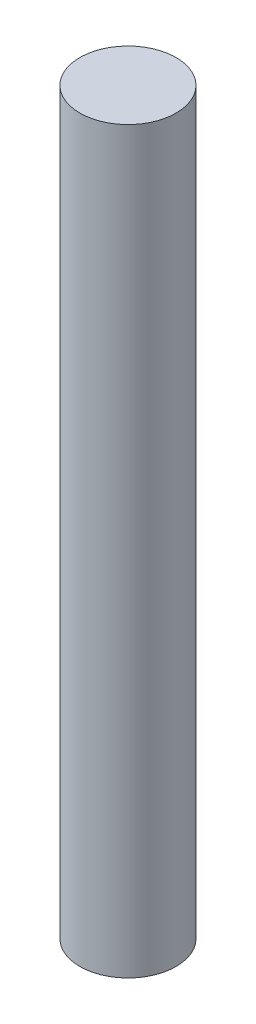
ISO-10303-21;
HEADER;
FILE_DESCRIPTION(('STEP AP214'),'2;1');
FILE_NAME('part.step','',(''),(''),'','','');
FILE_SCHEMA(('AUTOMOTIVE_DESIGN { 1 0 10303 214 1 1 1 1 }'));
ENDSEC;
DATA;
#1=APPLICATION_CONTEXT('core data for automotive mechanical design processes');
#2=APPLICATION_PROTOCOL_DEFINITION('international standard','automotive_design',2000,#1);
#3=PRODUCT_CONTEXT('',#1,'mechanical');
#4=PRODUCT('Part','Part','',(#3));
#5=PRODUCT_RELATED_PRODUCT_CATEGORY('part','',(#4));
#6=PRODUCT_DEFINITION_FORMATION('','',#4);
#7=PRODUCT_DEFINITION_CONTEXT('part definition',#1,'design');
#8=PRODUCT_DEFINITION('design','',#6,#7);
#9=PRODUCT_DEFINITION_SHAPE('','',#8);
#10=(LENGTH_UNIT() NAMED_UNIT(*) SI_UNIT(.MILLI.,.METRE.));
#11=(NAMED_UNIT(*) PLANE_ANGLE_UNIT() SI_UNIT($,.RADIAN.));
#12=(NAMED_UNIT(*) SI_UNIT($,.STERADIAN.) SOLID_ANGLE_UNIT());
#13=UNCERTAINTY_MEASURE_WITH_UNIT(LENGTH_MEASURE(1.E-05),#10,'distance_accuracy_value','');
#14=(GEOMETRIC_REPRESENTATION_CONTEXT(3) GLOBAL_UNCERTAINTY_ASSIGNED_CONTEXT((#13)) GLOBAL_UNIT_ASSIGNED_CONTEXT((#10,
#11,#12)) REPRESENTATION_CONTEXT('',''));
#15=CARTESIAN_POINT('',(0.,0.,0.));
#16=DIRECTION('',(0.,0.,1.));
#17=DIRECTION('',(1.,0.,0.));
#18=AXIS2_PLACEMENT_3D('',#15,#16,#17);
#19=CARTESIAN_POINT('',(0.,23.8,0.));
#20=DIRECTION('',(0.,-1.,0.));
#21=DIRECTION('',(0.,0.,-1.));
#22=AXIS2_PLACEMENT_3D('',#19,#20,#21);
#23=CYLINDRICAL_SURFACE('',#22,1.55);
#24=CARTESIAN_POINT('',(0.,23.8,0.));
#25=DIRECTION('',(0.,1.,0.));
#26=DIRECTION('',(0.,0.,1.));
#27=AXIS2_PLACEMENT_3D('',#24,#25,#26);
#28=CIRCLE('',#27,1.55);
#29=CARTESIAN_POINT('',(0.,23.8,1.55));
#30=VERTEX_POINT('',#29);
#31=EDGE_CURVE('E10',#30,#30,#28,.T.);
#32=ORIENTED_EDGE('',*,*,#31,.F.);
#33=EDGE_LOOP('',(#32));
#34=FACE_BOUND('',#33,.T.);
#35=CARTESIAN_POINT('',(0.,0.,0.));
#36=DIRECTION('',(0.,1.,0.));
#37=DIRECTION('',(0.,0.,1.));
#38=AXIS2_PLACEMENT_3D('',#35,#36,#37);
#39=CIRCLE('',#38,1.55);
#40=CARTESIAN_POINT('',(0.,0.,1.55));
#41=VERTEX_POINT('',#40);
#42=EDGE_CURVE('E37',#41,#41,#39,.T.);
#43=ORIENTED_EDGE('',*,*,#42,.T.);
#44=EDGE_LOOP('',(#43));
#45=FACE_BOUND('',#44,.T.);
#46=ADVANCED_FACE('F34',(#34,#45),#23,.T.);
#47=CARTESIAN_POINT('',(0.,23.8,0.));
#48=DIRECTION('',(0.,1.,0.));
#49=DIRECTION('',(0.,0.,1.));
#50=AXIS2_PLACEMENT_3D('',#47,#48,#49);
#51=PLANE('',#50);
#52=ORIENTED_EDGE('',*,*,#31,.T.);
#53=EDGE_LOOP('',(#52));
#54=FACE_BOUND('',#53,.T.);
#55=ADVANCED_FACE('F49',(#54),#51,.T.);
#56=CARTESIAN_POINT('',(0.,0.,0.));
#57=DIRECTION('',(0.,1.,0.));
#58=DIRECTION('',(0.,0.,1.));
#59=AXIS2_PLACEMENT_3D('',#56,#57,#58);
#60=PLANE('',#59);
#61=ORIENTED_EDGE('',*,*,#42,.F.);
#62=EDGE_LOOP('',(#61));
#63=FACE_BOUND('',#62,.T.);
#64=ADVANCED_FACE('F47',(#63),#60,.F.);
#65=CLOSED_SHELL('',(#46,#55,#64));
#66=MANIFOLD_SOLID_BREP('B2',#65);
#67=ADVANCED_BREP_SHAPE_REPRESENTATION('',(#18,#66),#14);
#68=SHAPE_DEFINITION_REPRESENTATION(#9,#67);
ENDSEC;
END-ISO-10303-21;
